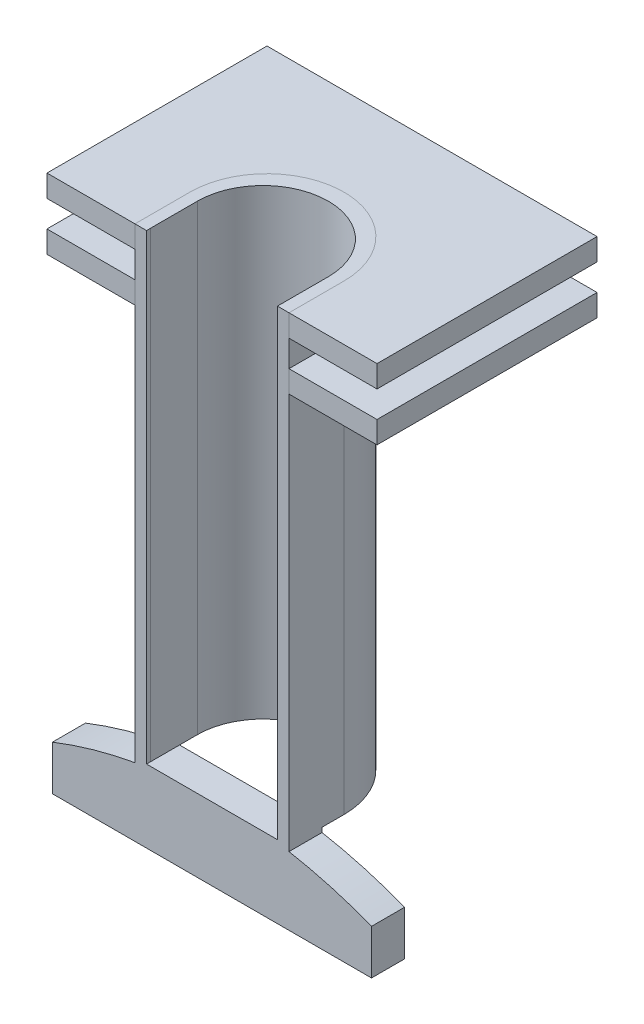
ISO-10303-21;
HEADER;
FILE_DESCRIPTION(('STEP AP214'),'2;1');
FILE_NAME('part.step','',(''),(''),'','','');
FILE_SCHEMA(('AUTOMOTIVE_DESIGN { 1 0 10303 214 1 1 1 1 }'));
ENDSEC;
DATA;
#1=APPLICATION_CONTEXT('core data for automotive mechanical design processes');
#2=APPLICATION_PROTOCOL_DEFINITION('international standard','automotive_design',2000,#1);
#3=PRODUCT_CONTEXT('',#1,'mechanical');
#4=PRODUCT('Part','Part','',(#3));
#5=PRODUCT_RELATED_PRODUCT_CATEGORY('part','',(#4));
#6=PRODUCT_DEFINITION_FORMATION('','',#4);
#7=PRODUCT_DEFINITION_CONTEXT('part definition',#1,'design');
#8=PRODUCT_DEFINITION('design','',#6,#7);
#9=PRODUCT_DEFINITION_SHAPE('','',#8);
#10=(LENGTH_UNIT() NAMED_UNIT(*) SI_UNIT(.MILLI.,.METRE.));
#11=(NAMED_UNIT(*) PLANE_ANGLE_UNIT() SI_UNIT($,.RADIAN.));
#12=(NAMED_UNIT(*) SI_UNIT($,.STERADIAN.) SOLID_ANGLE_UNIT());
#13=UNCERTAINTY_MEASURE_WITH_UNIT(LENGTH_MEASURE(1.E-05),#10,'distance_accuracy_value','');
#14=(GEOMETRIC_REPRESENTATION_CONTEXT(3) GLOBAL_UNCERTAINTY_ASSIGNED_CONTEXT((#13)) GLOBAL_UNIT_ASSIGNED_CONTEXT((#10,
#11,#12)) REPRESENTATION_CONTEXT('',''));
#15=CARTESIAN_POINT('',(0.,0.,0.));
#16=DIRECTION('',(0.,0.,1.));
#17=DIRECTION('',(1.,0.,0.));
#18=AXIS2_PLACEMENT_3D('',#15,#16,#17);
#19=CARTESIAN_POINT('',(-15.,35.6,0.));
#20=DIRECTION('',(-1.,0.,0.));
#21=DIRECTION('',(0.,0.,1.));
#22=AXIS2_PLACEMENT_3D('',#19,#20,#21);
#23=PLANE('',#22);
#24=DIRECTION('',(0.,0.,1.));
#25=VECTOR('',#24,1.);
#26=CARTESIAN_POINT('',(-15.,37.6,0.));
#27=LINE('',#26,#25);
#28=CARTESIAN_POINT('',(-15.,37.6,-20.));
#29=VERTEX_POINT('',#28);
#30=CARTESIAN_POINT('',(-15.,37.6,0.));
#31=VERTEX_POINT('',#30);
#32=EDGE_CURVE('E159',#29,#31,#27,.T.);
#33=ORIENTED_EDGE('',*,*,#32,.F.);
#34=DIRECTION('',(0.,1.,0.));
#35=VECTOR('',#34,1.);
#36=CARTESIAN_POINT('',(-15.,35.6,-20.));
#37=LINE('',#36,#35);
#38=CARTESIAN_POINT('',(-15.,35.6,-20.));
#39=VERTEX_POINT('',#38);
#40=EDGE_CURVE('E12',#39,#29,#37,.T.);
#41=ORIENTED_EDGE('',*,*,#40,.F.);
#42=DIRECTION('',(0.,0.,1.));
#43=VECTOR('',#42,1.);
#44=CARTESIAN_POINT('',(-15.,35.6,0.));
#45=LINE('',#44,#43);
#46=CARTESIAN_POINT('',(-15.,35.6,0.));
#47=VERTEX_POINT('',#46);
#48=EDGE_CURVE('E179',#39,#47,#45,.T.);
#49=ORIENTED_EDGE('',*,*,#48,.T.);
#50=DIRECTION('',(0.,1.,0.));
#51=VECTOR('',#50,1.);
#52=CARTESIAN_POINT('',(-15.,35.6,0.));
#53=LINE('',#52,#51);
#54=EDGE_CURVE('E65',#47,#31,#53,.T.);
#55=ORIENTED_EDGE('',*,*,#54,.T.);
#56=EDGE_LOOP('',(#33,#41,#49,#55));
#57=FACE_BOUND('',#56,.T.);
#58=ADVANCED_FACE('F62',(#57),#23,.T.);
#59=CARTESIAN_POINT('',(-15.,35.6,-20.));
#60=DIRECTION('',(0.,0.,-1.));
#61=DIRECTION('',(-1.,0.,0.));
#62=AXIS2_PLACEMENT_3D('',#59,#60,#61);
#63=PLANE('',#62);
#64=DIRECTION('',(-1.,0.,0.));
#65=VECTOR('',#64,1.);
#66=CARTESIAN_POINT('',(-15.,37.6,-20.));
#67=LINE('',#66,#65);
#68=CARTESIAN_POINT('',(15.,37.6,-20.));
#69=VERTEX_POINT('',#68);
#70=EDGE_CURVE('E177',#69,#29,#67,.T.);
#71=ORIENTED_EDGE('',*,*,#70,.F.);
#72=DIRECTION('',(0.,1.,0.));
#73=VECTOR('',#72,1.);
#74=CARTESIAN_POINT('',(15.,35.6,-20.));
#75=LINE('',#74,#73);
#76=CARTESIAN_POINT('',(15.,35.6,-20.));
#77=VERTEX_POINT('',#76);
#78=EDGE_CURVE('E71',#77,#69,#75,.T.);
#79=ORIENTED_EDGE('',*,*,#78,.F.);
#80=DIRECTION('',(-1.,0.,0.));
#81=VECTOR('',#80,1.);
#82=CARTESIAN_POINT('',(-15.,35.6,-20.));
#83=LINE('',#82,#81);
#84=EDGE_CURVE('E149',#77,#39,#83,.T.);
#85=ORIENTED_EDGE('',*,*,#84,.T.);
#86=ORIENTED_EDGE('',*,*,#40,.T.);
#87=EDGE_LOOP('',(#71,#79,#85,#86));
#88=FACE_BOUND('',#87,.T.);
#89=ADVANCED_FACE('F191',(#88),#63,.T.);
#90=CARTESIAN_POINT('',(15.,35.6,0.));
#91=DIRECTION('',(1.,0.,0.));
#92=DIRECTION('',(0.,0.,-1.));
#93=AXIS2_PLACEMENT_3D('',#90,#91,#92);
#94=PLANE('',#93);
#95=DIRECTION('',(0.,0.,-1.));
#96=VECTOR('',#95,1.);
#97=CARTESIAN_POINT('',(15.,37.6,0.));
#98=LINE('',#97,#96);
#99=CARTESIAN_POINT('',(15.,37.6,0.));
#100=VERTEX_POINT('',#99);
#101=EDGE_CURVE('E136',#100,#69,#98,.T.);
#102=ORIENTED_EDGE('',*,*,#101,.F.);
#103=DIRECTION('',(0.,1.,0.));
#104=VECTOR('',#103,1.);
#105=CARTESIAN_POINT('',(15.,35.6,0.));
#106=LINE('',#105,#104);
#107=CARTESIAN_POINT('',(15.,35.6,0.));
#108=VERTEX_POINT('',#107);
#109=EDGE_CURVE('E131',#108,#100,#106,.T.);
#110=ORIENTED_EDGE('',*,*,#109,.F.);
#111=DIRECTION('',(0.,0.,-1.));
#112=VECTOR('',#111,1.);
#113=CARTESIAN_POINT('',(15.,35.6,0.));
#114=LINE('',#113,#112);
#115=EDGE_CURVE('E134',#108,#77,#114,.T.);
#116=ORIENTED_EDGE('',*,*,#115,.T.);
#117=ORIENTED_EDGE('',*,*,#78,.T.);
#118=EDGE_LOOP('',(#102,#110,#116,#117));
#119=FACE_BOUND('',#118,.T.);
#120=ADVANCED_FACE('F133',(#119),#94,.T.);
#121=CARTESIAN_POINT('',(7.,35.6,0.));
#122=DIRECTION('',(0.,0.,1.));
#123=DIRECTION('',(1.,0.,0.));
#124=AXIS2_PLACEMENT_3D('',#121,#122,#123);
#125=PLANE('',#124);
#126=DIRECTION('',(1.,0.,0.));
#127=VECTOR('',#126,1.);
#128=CARTESIAN_POINT('',(7.,37.6,0.));
#129=LINE('',#128,#127);
#130=CARTESIAN_POINT('',(7.,37.6,0.));
#131=VERTEX_POINT('',#130);
#132=EDGE_CURVE('E174',#131,#100,#129,.T.);
#133=ORIENTED_EDGE('',*,*,#132,.F.);
#134=DIRECTION('',(0.,1.,0.));
#135=VECTOR('',#134,1.);
#136=CARTESIAN_POINT('',(7.,35.6,0.));
#137=LINE('',#136,#135);
#138=CARTESIAN_POINT('',(7.,35.6,0.));
#139=VERTEX_POINT('',#138);
#140=EDGE_CURVE('E141',#139,#131,#137,.T.);
#141=ORIENTED_EDGE('',*,*,#140,.F.);
#142=DIRECTION('',(1.,0.,0.));
#143=VECTOR('',#142,1.);
#144=CARTESIAN_POINT('',(7.,35.6,0.));
#145=LINE('',#144,#143);
#146=EDGE_CURVE('E147',#139,#108,#145,.T.);
#147=ORIENTED_EDGE('',*,*,#146,.T.);
#148=ORIENTED_EDGE('',*,*,#109,.T.);
#149=EDGE_LOOP('',(#133,#141,#147,#148));
#150=FACE_BOUND('',#149,.T.);
#151=ADVANCED_FACE('F151',(#150),#125,.T.);
#152=CARTESIAN_POINT('',(7.,35.6,0.));
#153=DIRECTION('',(-1.,0.,0.));
#154=DIRECTION('',(0.,0.,1.));
#155=AXIS2_PLACEMENT_3D('',#152,#153,#154);
#156=PLANE('',#155);
#157=DIRECTION('',(0.,0.,1.));
#158=VECTOR('',#157,1.);
#159=CARTESIAN_POINT('',(7.,37.6,0.));
#160=LINE('',#159,#158);
#161=CARTESIAN_POINT('',(7.,37.6,-5.));
#162=VERTEX_POINT('',#161);
#163=EDGE_CURVE('E171',#162,#131,#160,.T.);
#164=ORIENTED_EDGE('',*,*,#163,.F.);
#165=DIRECTION('',(0.,1.,0.));
#166=VECTOR('',#165,1.);
#167=CARTESIAN_POINT('',(7.,35.6,-5.));
#168=LINE('',#167,#166);
#169=CARTESIAN_POINT('',(7.,35.6,-5.));
#170=VERTEX_POINT('',#169);
#171=EDGE_CURVE('E183',#170,#162,#168,.T.);
#172=ORIENTED_EDGE('',*,*,#171,.F.);
#173=DIRECTION('',(0.,0.,1.));
#174=VECTOR('',#173,1.);
#175=CARTESIAN_POINT('',(7.,35.6,0.));
#176=LINE('',#175,#174);
#177=EDGE_CURVE('E152',#170,#139,#176,.T.);
#178=ORIENTED_EDGE('',*,*,#177,.T.);
#179=ORIENTED_EDGE('',*,*,#140,.T.);
#180=EDGE_LOOP('',(#164,#172,#178,#179));
#181=FACE_BOUND('',#180,.T.);
#182=ADVANCED_FACE('F204',(#181),#156,.T.);
#183=CARTESIAN_POINT('',(0.,35.6,-5.));
#184=DIRECTION('',(0.,1.,0.));
#185=DIRECTION('',(0.,0.,1.));
#186=AXIS2_PLACEMENT_3D('',#183,#184,#185);
#187=CYLINDRICAL_SURFACE('',#186,7.);
#188=CARTESIAN_POINT('',(0.,37.6,-5.));
#189=DIRECTION('',(0.,-1.,0.));
#190=DIRECTION('',(0.,0.,1.));
#191=AXIS2_PLACEMENT_3D('',#188,#189,#190);
#192=CIRCLE('',#191,7.);
#193=CARTESIAN_POINT('',(-7.,37.6,-5.));
#194=VERTEX_POINT('',#193);
#195=EDGE_CURVE('E168',#194,#162,#192,.T.);
#196=ORIENTED_EDGE('',*,*,#195,.F.);
#197=DIRECTION('',(0.,1.,0.));
#198=VECTOR('',#197,1.);
#199=CARTESIAN_POINT('',(-7.,35.6,-5.));
#200=LINE('',#199,#198);
#201=CARTESIAN_POINT('',(-7.,35.6,-5.));
#202=VERTEX_POINT('',#201);
#203=EDGE_CURVE('E185',#202,#194,#200,.T.);
#204=ORIENTED_EDGE('',*,*,#203,.F.);
#205=CARTESIAN_POINT('',(0.,35.6,-5.));
#206=DIRECTION('',(0.,-1.,0.));
#207=DIRECTION('',(0.,0.,1.));
#208=AXIS2_PLACEMENT_3D('',#205,#206,#207);
#209=CIRCLE('',#208,7.);
#210=EDGE_CURVE('E154',#202,#170,#209,.T.);
#211=ORIENTED_EDGE('',*,*,#210,.T.);
#212=ORIENTED_EDGE('',*,*,#171,.T.);
#213=EDGE_LOOP('',(#196,#204,#211,#212));
#214=FACE_BOUND('',#213,.T.);
#215=ADVANCED_FACE('F207',(#214),#187,.F.);
#216=CARTESIAN_POINT('',(-7.,35.6,-5.));
#217=DIRECTION('',(1.,0.,0.));
#218=DIRECTION('',(0.,0.,-1.));
#219=AXIS2_PLACEMENT_3D('',#216,#217,#218);
#220=PLANE('',#219);
#221=DIRECTION('',(0.,0.,-1.));
#222=VECTOR('',#221,1.);
#223=CARTESIAN_POINT('',(-7.,37.6,-5.));
#224=LINE('',#223,#222);
#225=CARTESIAN_POINT('',(-7.,37.6,0.));
#226=VERTEX_POINT('',#225);
#227=EDGE_CURVE('E165',#226,#194,#224,.T.);
#228=ORIENTED_EDGE('',*,*,#227,.F.);
#229=DIRECTION('',(0.,1.,0.));
#230=VECTOR('',#229,1.);
#231=CARTESIAN_POINT('',(-7.,35.6,0.));
#232=LINE('',#231,#230);
#233=CARTESIAN_POINT('',(-7.,35.6,0.));
#234=VERTEX_POINT('',#233);
#235=EDGE_CURVE('E186',#234,#226,#232,.T.);
#236=ORIENTED_EDGE('',*,*,#235,.F.);
#237=DIRECTION('',(0.,0.,-1.));
#238=VECTOR('',#237,1.);
#239=CARTESIAN_POINT('',(-7.,35.6,-5.));
#240=LINE('',#239,#238);
#241=EDGE_CURVE('E282',#234,#202,#240,.T.);
#242=ORIENTED_EDGE('',*,*,#241,.T.);
#243=ORIENTED_EDGE('',*,*,#203,.T.);
#244=EDGE_LOOP('',(#228,#236,#242,#243));
#245=FACE_BOUND('',#244,.T.);
#246=ADVANCED_FACE('F211',(#245),#220,.T.);
#247=CARTESIAN_POINT('',(-15.,35.6,0.));
#248=DIRECTION('',(0.,0.,1.));
#249=DIRECTION('',(1.,0.,0.));
#250=AXIS2_PLACEMENT_3D('',#247,#248,#249);
#251=PLANE('',#250);
#252=DIRECTION('',(1.,0.,0.));
#253=VECTOR('',#252,1.);
#254=CARTESIAN_POINT('',(-15.,37.6,0.));
#255=LINE('',#254,#253);
#256=EDGE_CURVE('E162',#31,#226,#255,.T.);
#257=ORIENTED_EDGE('',*,*,#256,.F.);
#258=ORIENTED_EDGE('',*,*,#54,.F.);
#259=DIRECTION('',(1.,0.,0.));
#260=VECTOR('',#259,1.);
#261=CARTESIAN_POINT('',(-15.,35.6,0.));
#262=LINE('',#261,#260);
#263=EDGE_CURVE('E283',#47,#234,#262,.T.);
#264=ORIENTED_EDGE('',*,*,#263,.T.);
#265=ORIENTED_EDGE('',*,*,#235,.T.);
#266=EDGE_LOOP('',(#257,#258,#264,#265));
#267=FACE_BOUND('',#266,.T.);
#268=ADVANCED_FACE('F188',(#267),#251,.T.);
#269=CARTESIAN_POINT('',(0.,35.6,-5.));
#270=DIRECTION('',(0.,1.,0.));
#271=DIRECTION('',(0.,0.,1.));
#272=AXIS2_PLACEMENT_3D('',#269,#270,#271);
#273=PLANE('',#272);
#274=ORIENTED_EDGE('',*,*,#48,.F.);
#275=ORIENTED_EDGE('',*,*,#84,.F.);
#276=ORIENTED_EDGE('',*,*,#115,.F.);
#277=ORIENTED_EDGE('',*,*,#146,.F.);
#278=ORIENTED_EDGE('',*,*,#177,.F.);
#279=ORIENTED_EDGE('',*,*,#210,.F.);
#280=ORIENTED_EDGE('',*,*,#241,.F.);
#281=ORIENTED_EDGE('',*,*,#263,.F.);
#282=EDGE_LOOP('',(#274,#275,#276,#277,#278,#279,#280,#281));
#283=FACE_BOUND('',#282,.T.);
#284=ADVANCED_FACE('F145',(#283),#273,.F.);
#285=CARTESIAN_POINT('',(0.,37.6,-5.));
#286=DIRECTION('',(0.,1.,0.));
#287=DIRECTION('',(0.,0.,1.));
#288=AXIS2_PLACEMENT_3D('',#285,#286,#287);
#289=PLANE('',#288);
#290=ORIENTED_EDGE('',*,*,#32,.T.);
#291=ORIENTED_EDGE('',*,*,#256,.T.);
#292=ORIENTED_EDGE('',*,*,#227,.T.);
#293=ORIENTED_EDGE('',*,*,#195,.T.);
#294=ORIENTED_EDGE('',*,*,#163,.T.);
#295=ORIENTED_EDGE('',*,*,#132,.T.);
#296=ORIENTED_EDGE('',*,*,#101,.T.);
#297=ORIENTED_EDGE('',*,*,#70,.T.);
#298=EDGE_LOOP('',(#290,#291,#292,#293,#294,#295,#296,#297));
#299=FACE_BOUND('',#298,.T.);
#300=ADVANCED_FACE('F190',(#299),#289,.T.);
#301=CLOSED_SHELL('',(#58,#89,#120,#151,#182,#215,#246,#268,#284,#300));
#302=MANIFOLD_SOLID_BREP('B2',#301);
#303=CARTESIAN_POINT('',(-15.,40.,0.));
#304=DIRECTION('',(-1.,0.,0.));
#305=DIRECTION('',(0.,0.,1.));
#306=AXIS2_PLACEMENT_3D('',#303,#304,#305);
#307=PLANE('',#306);
#308=DIRECTION('',(0.,0.,1.));
#309=VECTOR('',#308,1.);
#310=CARTESIAN_POINT('',(-15.,42.,0.));
#311=LINE('',#310,#309);
#312=CARTESIAN_POINT('',(-15.,42.,-20.));
#313=VERTEX_POINT('',#312);
#314=CARTESIAN_POINT('',(-15.,42.,0.));
#315=VERTEX_POINT('',#314);
#316=EDGE_CURVE('E395',#313,#315,#311,.T.);
#317=ORIENTED_EDGE('',*,*,#316,.F.);
#318=DIRECTION('',(0.,1.,0.));
#319=VECTOR('',#318,1.);
#320=CARTESIAN_POINT('',(-15.,40.,-20.));
#321=LINE('',#320,#319);
#322=CARTESIAN_POINT('',(-15.,40.,-20.));
#323=VERTEX_POINT('',#322);
#324=EDGE_CURVE('E60',#323,#313,#321,.T.);
#325=ORIENTED_EDGE('',*,*,#324,.F.);
#326=DIRECTION('',(0.,0.,1.));
#327=VECTOR('',#326,1.);
#328=CARTESIAN_POINT('',(-15.,40.,0.));
#329=LINE('',#328,#327);
#330=CARTESIAN_POINT('',(-15.,40.,0.));
#331=VERTEX_POINT('',#330);
#332=EDGE_CURVE('E415',#323,#331,#329,.T.);
#333=ORIENTED_EDGE('',*,*,#332,.T.);
#334=DIRECTION('',(0.,1.,0.));
#335=VECTOR('',#334,1.);
#336=CARTESIAN_POINT('',(-15.,40.,0.));
#337=LINE('',#336,#335);
#338=EDGE_CURVE('E301',#331,#315,#337,.T.);
#339=ORIENTED_EDGE('',*,*,#338,.T.);
#340=EDGE_LOOP('',(#317,#325,#333,#339));
#341=FACE_BOUND('',#340,.T.);
#342=ADVANCED_FACE('F298',(#341),#307,.T.);
#343=CARTESIAN_POINT('',(-15.,40.,-20.));
#344=DIRECTION('',(0.,0.,-1.));
#345=DIRECTION('',(-1.,0.,0.));
#346=AXIS2_PLACEMENT_3D('',#343,#344,#345);
#347=PLANE('',#346);
#348=DIRECTION('',(-1.,0.,0.));
#349=VECTOR('',#348,1.);
#350=CARTESIAN_POINT('',(-15.,42.,-20.));
#351=LINE('',#350,#349);
#352=CARTESIAN_POINT('',(15.,42.,-20.));
#353=VERTEX_POINT('',#352);
#354=EDGE_CURVE('E413',#353,#313,#351,.T.);
#355=ORIENTED_EDGE('',*,*,#354,.F.);
#356=DIRECTION('',(0.,1.,0.));
#357=VECTOR('',#356,1.);
#358=CARTESIAN_POINT('',(15.,40.,-20.));
#359=LINE('',#358,#357);
#360=CARTESIAN_POINT('',(15.,40.,-20.));
#361=VERTEX_POINT('',#360);
#362=EDGE_CURVE('E307',#361,#353,#359,.T.);
#363=ORIENTED_EDGE('',*,*,#362,.F.);
#364=DIRECTION('',(-1.,0.,0.));
#365=VECTOR('',#364,1.);
#366=CARTESIAN_POINT('',(-15.,40.,-20.));
#367=LINE('',#366,#365);
#368=EDGE_CURVE('E385',#361,#323,#367,.T.);
#369=ORIENTED_EDGE('',*,*,#368,.T.);
#370=ORIENTED_EDGE('',*,*,#324,.T.);
#371=EDGE_LOOP('',(#355,#363,#369,#370));
#372=FACE_BOUND('',#371,.T.);
#373=ADVANCED_FACE('F427',(#372),#347,.T.);
#374=CARTESIAN_POINT('',(15.,40.,0.));
#375=DIRECTION('',(1.,0.,0.));
#376=DIRECTION('',(0.,0.,-1.));
#377=AXIS2_PLACEMENT_3D('',#374,#375,#376);
#378=PLANE('',#377);
#379=DIRECTION('',(0.,0.,-1.));
#380=VECTOR('',#379,1.);
#381=CARTESIAN_POINT('',(15.,42.,0.));
#382=LINE('',#381,#380);
#383=CARTESIAN_POINT('',(15.,42.,0.));
#384=VERTEX_POINT('',#383);
#385=EDGE_CURVE('E372',#384,#353,#382,.T.);
#386=ORIENTED_EDGE('',*,*,#385,.F.);
#387=DIRECTION('',(0.,1.,0.));
#388=VECTOR('',#387,1.);
#389=CARTESIAN_POINT('',(15.,40.,0.));
#390=LINE('',#389,#388);
#391=CARTESIAN_POINT('',(15.,40.,0.));
#392=VERTEX_POINT('',#391);
#393=EDGE_CURVE('E367',#392,#384,#390,.T.);
#394=ORIENTED_EDGE('',*,*,#393,.F.);
#395=DIRECTION('',(0.,0.,-1.));
#396=VECTOR('',#395,1.);
#397=CARTESIAN_POINT('',(15.,40.,0.));
#398=LINE('',#397,#396);
#399=EDGE_CURVE('E370',#392,#361,#398,.T.);
#400=ORIENTED_EDGE('',*,*,#399,.T.);
#401=ORIENTED_EDGE('',*,*,#362,.T.);
#402=EDGE_LOOP('',(#386,#394,#400,#401));
#403=FACE_BOUND('',#402,.T.);
#404=ADVANCED_FACE('F369',(#403),#378,.T.);
#405=CARTESIAN_POINT('',(7.,40.,0.));
#406=DIRECTION('',(0.,0.,1.));
#407=DIRECTION('',(1.,0.,0.));
#408=AXIS2_PLACEMENT_3D('',#405,#406,#407);
#409=PLANE('',#408);
#410=DIRECTION('',(1.,0.,0.));
#411=VECTOR('',#410,1.);
#412=CARTESIAN_POINT('',(7.,42.,0.));
#413=LINE('',#412,#411);
#414=CARTESIAN_POINT('',(7.,42.,0.));
#415=VERTEX_POINT('',#414);
#416=EDGE_CURVE('E410',#415,#384,#413,.T.);
#417=ORIENTED_EDGE('',*,*,#416,.F.);
#418=DIRECTION('',(0.,1.,0.));
#419=VECTOR('',#418,1.);
#420=CARTESIAN_POINT('',(7.,40.,0.));
#421=LINE('',#420,#419);
#422=CARTESIAN_POINT('',(7.,40.,0.));
#423=VERTEX_POINT('',#422);
#424=EDGE_CURVE('E377',#423,#415,#421,.T.);
#425=ORIENTED_EDGE('',*,*,#424,.F.);
#426=DIRECTION('',(1.,0.,0.));
#427=VECTOR('',#426,1.);
#428=CARTESIAN_POINT('',(7.,40.,0.));
#429=LINE('',#428,#427);
#430=EDGE_CURVE('E383',#423,#392,#429,.T.);
#431=ORIENTED_EDGE('',*,*,#430,.T.);
#432=ORIENTED_EDGE('',*,*,#393,.T.);
#433=EDGE_LOOP('',(#417,#425,#431,#432));
#434=FACE_BOUND('',#433,.T.);
#435=ADVANCED_FACE('F387',(#434),#409,.T.);
#436=CARTESIAN_POINT('',(7.,40.,0.));
#437=DIRECTION('',(-1.,0.,0.));
#438=DIRECTION('',(0.,0.,1.));
#439=AXIS2_PLACEMENT_3D('',#436,#437,#438);
#440=PLANE('',#439);
#441=DIRECTION('',(0.,0.,1.));
#442=VECTOR('',#441,1.);
#443=CARTESIAN_POINT('',(7.,42.,0.));
#444=LINE('',#443,#442);
#445=CARTESIAN_POINT('',(7.,42.,-5.));
#446=VERTEX_POINT('',#445);
#447=EDGE_CURVE('E407',#446,#415,#444,.T.);
#448=ORIENTED_EDGE('',*,*,#447,.F.);
#449=DIRECTION('',(0.,1.,0.));
#450=VECTOR('',#449,1.);
#451=CARTESIAN_POINT('',(7.,40.,-5.));
#452=LINE('',#451,#450);
#453=CARTESIAN_POINT('',(7.,40.,-5.));
#454=VERTEX_POINT('',#453);
#455=EDGE_CURVE('E419',#454,#446,#452,.T.);
#456=ORIENTED_EDGE('',*,*,#455,.F.);
#457=DIRECTION('',(0.,0.,1.));
#458=VECTOR('',#457,1.);
#459=CARTESIAN_POINT('',(7.,40.,0.));
#460=LINE('',#459,#458);
#461=EDGE_CURVE('E388',#454,#423,#460,.T.);
#462=ORIENTED_EDGE('',*,*,#461,.T.);
#463=ORIENTED_EDGE('',*,*,#424,.T.);
#464=EDGE_LOOP('',(#448,#456,#462,#463));
#465=FACE_BOUND('',#464,.T.);
#466=ADVANCED_FACE('F440',(#465),#440,.T.);
#467=CARTESIAN_POINT('',(0.,40.,-5.));
#468=DIRECTION('',(0.,1.,0.));
#469=DIRECTION('',(0.,0.,1.));
#470=AXIS2_PLACEMENT_3D('',#467,#468,#469);
#471=CYLINDRICAL_SURFACE('',#470,7.);
#472=CARTESIAN_POINT('',(0.,42.,-5.));
#473=DIRECTION('',(0.,-1.,0.));
#474=DIRECTION('',(0.,0.,1.));
#475=AXIS2_PLACEMENT_3D('',#472,#473,#474);
#476=CIRCLE('',#475,7.);
#477=CARTESIAN_POINT('',(-7.,42.,-5.));
#478=VERTEX_POINT('',#477);
#479=EDGE_CURVE('E404',#478,#446,#476,.T.);
#480=ORIENTED_EDGE('',*,*,#479,.F.);
#481=DIRECTION('',(0.,1.,0.));
#482=VECTOR('',#481,1.);
#483=CARTESIAN_POINT('',(-7.,40.,-5.));
#484=LINE('',#483,#482);
#485=CARTESIAN_POINT('',(-7.,40.,-5.));
#486=VERTEX_POINT('',#485);
#487=EDGE_CURVE('E421',#486,#478,#484,.T.);
#488=ORIENTED_EDGE('',*,*,#487,.F.);
#489=CARTESIAN_POINT('',(0.,40.,-5.));
#490=DIRECTION('',(0.,-1.,0.));
#491=DIRECTION('',(0.,0.,1.));
#492=AXIS2_PLACEMENT_3D('',#489,#490,#491);
#493=CIRCLE('',#492,7.);
#494=EDGE_CURVE('E390',#486,#454,#493,.T.);
#495=ORIENTED_EDGE('',*,*,#494,.T.);
#496=ORIENTED_EDGE('',*,*,#455,.T.);
#497=EDGE_LOOP('',(#480,#488,#495,#496));
#498=FACE_BOUND('',#497,.T.);
#499=ADVANCED_FACE('F443',(#498),#471,.F.);
#500=CARTESIAN_POINT('',(-7.,40.,-5.));
#501=DIRECTION('',(1.,0.,0.));
#502=DIRECTION('',(0.,0.,-1.));
#503=AXIS2_PLACEMENT_3D('',#500,#501,#502);
#504=PLANE('',#503);
#505=DIRECTION('',(0.,0.,-1.));
#506=VECTOR('',#505,1.);
#507=CARTESIAN_POINT('',(-7.,42.,-5.));
#508=LINE('',#507,#506);
#509=CARTESIAN_POINT('',(-7.,42.,0.));
#510=VERTEX_POINT('',#509);
#511=EDGE_CURVE('E401',#510,#478,#508,.T.);
#512=ORIENTED_EDGE('',*,*,#511,.F.);
#513=DIRECTION('',(0.,1.,0.));
#514=VECTOR('',#513,1.);
#515=CARTESIAN_POINT('',(-7.,40.,0.));
#516=LINE('',#515,#514);
#517=CARTESIAN_POINT('',(-7.,40.,0.));
#518=VERTEX_POINT('',#517);
#519=EDGE_CURVE('E422',#518,#510,#516,.T.);
#520=ORIENTED_EDGE('',*,*,#519,.F.);
#521=DIRECTION('',(0.,0.,-1.));
#522=VECTOR('',#521,1.);
#523=CARTESIAN_POINT('',(-7.,40.,-5.));
#524=LINE('',#523,#522);
#525=EDGE_CURVE('E518',#518,#486,#524,.T.);
#526=ORIENTED_EDGE('',*,*,#525,.T.);
#527=ORIENTED_EDGE('',*,*,#487,.T.);
#528=EDGE_LOOP('',(#512,#520,#526,#527));
#529=FACE_BOUND('',#528,.T.);
#530=ADVANCED_FACE('F447',(#529),#504,.T.);
#531=CARTESIAN_POINT('',(-15.,40.,0.));
#532=DIRECTION('',(0.,0.,1.));
#533=DIRECTION('',(1.,0.,0.));
#534=AXIS2_PLACEMENT_3D('',#531,#532,#533);
#535=PLANE('',#534);
#536=DIRECTION('',(1.,0.,0.));
#537=VECTOR('',#536,1.);
#538=CARTESIAN_POINT('',(-15.,42.,0.));
#539=LINE('',#538,#537);
#540=EDGE_CURVE('E398',#315,#510,#539,.T.);
#541=ORIENTED_EDGE('',*,*,#540,.F.);
#542=ORIENTED_EDGE('',*,*,#338,.F.);
#543=DIRECTION('',(1.,0.,0.));
#544=VECTOR('',#543,1.);
#545=CARTESIAN_POINT('',(-15.,40.,0.));
#546=LINE('',#545,#544);
#547=EDGE_CURVE('E519',#331,#518,#546,.T.);
#548=ORIENTED_EDGE('',*,*,#547,.T.);
#549=ORIENTED_EDGE('',*,*,#519,.T.);
#550=EDGE_LOOP('',(#541,#542,#548,#549));
#551=FACE_BOUND('',#550,.T.);
#552=ADVANCED_FACE('F424',(#551),#535,.T.);
#553=CARTESIAN_POINT('',(0.,40.,-5.));
#554=DIRECTION('',(0.,1.,0.));
#555=DIRECTION('',(0.,0.,1.));
#556=AXIS2_PLACEMENT_3D('',#553,#554,#555);
#557=PLANE('',#556);
#558=ORIENTED_EDGE('',*,*,#332,.F.);
#559=ORIENTED_EDGE('',*,*,#368,.F.);
#560=ORIENTED_EDGE('',*,*,#399,.F.);
#561=ORIENTED_EDGE('',*,*,#430,.F.);
#562=ORIENTED_EDGE('',*,*,#461,.F.);
#563=ORIENTED_EDGE('',*,*,#494,.F.);
#564=ORIENTED_EDGE('',*,*,#525,.F.);
#565=ORIENTED_EDGE('',*,*,#547,.F.);
#566=EDGE_LOOP('',(#558,#559,#560,#561,#562,#563,#564,#565));
#567=FACE_BOUND('',#566,.T.);
#568=ADVANCED_FACE('F381',(#567),#557,.F.);
#569=CARTESIAN_POINT('',(0.,42.,-5.));
#570=DIRECTION('',(0.,1.,0.));
#571=DIRECTION('',(0.,0.,1.));
#572=AXIS2_PLACEMENT_3D('',#569,#570,#571);
#573=PLANE('',#572);
#574=ORIENTED_EDGE('',*,*,#316,.T.);
#575=ORIENTED_EDGE('',*,*,#540,.T.);
#576=ORIENTED_EDGE('',*,*,#511,.T.);
#577=ORIENTED_EDGE('',*,*,#479,.T.);
#578=ORIENTED_EDGE('',*,*,#447,.T.);
#579=ORIENTED_EDGE('',*,*,#416,.T.);
#580=ORIENTED_EDGE('',*,*,#385,.T.);
#581=ORIENTED_EDGE('',*,*,#354,.T.);
#582=EDGE_LOOP('',(#574,#575,#576,#577,#578,#579,#580,#581));
#583=FACE_BOUND('',#582,.T.);
#584=ADVANCED_FACE('F426',(#583),#573,.T.);
#585=CLOSED_SHELL('',(#342,#373,#404,#435,#466,#499,#530,#552,#568,#584));
#586=MANIFOLD_SOLID_BREP('B6',#585);
#587=CARTESIAN_POINT('',(0.,42.,-0.375));
#588=DIRECTION('',(0.,-1.,0.));
#589=DIRECTION('',(0.,0.,-1.));
#590=AXIS2_PLACEMENT_3D('',#587,#588,#589);
#591=CYLINDRICAL_SURFACE('',#590,5.95);
#592=CARTESIAN_POINT('',(0.,0.,-0.375));
#593=DIRECTION('',(0.,1.,0.));
#594=DIRECTION('',(0.,0.,1.));
#595=AXIS2_PLACEMENT_3D('',#592,#593,#594);
#596=CIRCLE('',#595,5.95);
#597=CARTESIAN_POINT('',(5.93817101471488,0.,0.));
#598=VERTEX_POINT('',#597);
#599=CARTESIAN_POINT('',(5.95,0.,-0.375));
#600=VERTEX_POINT('',#599);
#601=EDGE_CURVE('E714',#598,#600,#596,.T.);
#602=ORIENTED_EDGE('',*,*,#601,.F.);
#603=DIRECTION('',(0.,-1.,0.));
#604=VECTOR('',#603,1.);
#605=CARTESIAN_POINT('',(5.93817101471488,42.,0.));
#606=LINE('',#605,#604);
#607=CARTESIAN_POINT('',(5.93817101471488,42.,0.));
#608=VERTEX_POINT('',#607);
#609=EDGE_CURVE('E529',#608,#598,#606,.T.);
#610=ORIENTED_EDGE('',*,*,#609,.F.);
#611=CARTESIAN_POINT('',(0.,42.,-0.375));
#612=DIRECTION('',(0.,1.,0.));
#613=DIRECTION('',(0.,0.,1.));
#614=AXIS2_PLACEMENT_3D('',#611,#612,#613);
#615=CIRCLE('',#614,5.95);
#616=CARTESIAN_POINT('',(5.95,42.,-0.375));
#617=VERTEX_POINT('',#616);
#618=EDGE_CURVE('E727',#608,#617,#615,.T.);
#619=ORIENTED_EDGE('',*,*,#618,.T.);
#620=DIRECTION('',(0.,-1.,0.));
#621=VECTOR('',#620,1.);
#622=CARTESIAN_POINT('',(5.95,42.,-0.375));
#623=LINE('',#622,#621);
#624=EDGE_CURVE('E763',#617,#600,#623,.T.);
#625=ORIENTED_EDGE('',*,*,#624,.T.);
#626=EDGE_LOOP('',(#602,#610,#619,#625));
#627=FACE_BOUND('',#626,.T.);
#628=ADVANCED_FACE('F526',(#627),#591,.F.);
#629=CARTESIAN_POINT('',(7.,42.,0.));
#630=DIRECTION('',(-1.,0.,0.));
#631=DIRECTION('',(0.,0.,1.));
#632=AXIS2_PLACEMENT_3D('',#629,#630,#631);
#633=PLANE('',#632);
#634=DIRECTION('',(0.,-1.,0.));
#635=VECTOR('',#634,1.);
#636=CARTESIAN_POINT('',(7.,42.,0.));
#637=LINE('',#636,#635);
#638=CARTESIAN_POINT('',(7.,42.,0.));
#639=VERTEX_POINT('',#638);
#640=CARTESIAN_POINT('',(7.,-0.41578507890394,0.));
#641=VERTEX_POINT('',#640);
#642=EDGE_CURVE('E820',#639,#641,#637,.T.);
#643=ORIENTED_EDGE('',*,*,#642,.T.);
#644=DIRECTION('',(0.,0.,1.));
#645=VECTOR('',#644,1.);
#646=CARTESIAN_POINT('',(7.,-0.41578507890394,-3.));
#647=LINE('',#646,#645);
#648=CARTESIAN_POINT('',(7.,-0.41578507890394,-3.));
#649=VERTEX_POINT('',#648);
#650=EDGE_CURVE('E715',#649,#641,#647,.T.);
#651=ORIENTED_EDGE('',*,*,#650,.F.);
#652=DIRECTION('',(0.,1.,0.));
#653=VECTOR('',#652,1.);
#654=CARTESIAN_POINT('',(7.,0.,-3.));
#655=LINE('',#654,#653);
#656=CARTESIAN_POINT('',(7.,0.,-3.));
#657=VERTEX_POINT('',#656);
#658=EDGE_CURVE('E688',#649,#657,#655,.T.);
#659=ORIENTED_EDGE('',*,*,#658,.T.);
#660=DIRECTION('',(0.,0.,-1.));
#661=VECTOR('',#660,1.);
#662=CARTESIAN_POINT('',(7.,0.,0.));
#663=LINE('',#662,#661);
#664=CARTESIAN_POINT('',(7.,0.,-5.));
#665=VERTEX_POINT('',#664);
#666=EDGE_CURVE('E766',#657,#665,#663,.T.);
#667=ORIENTED_EDGE('',*,*,#666,.T.);
#668=DIRECTION('',(0.,-1.,0.));
#669=VECTOR('',#668,1.);
#670=CARTESIAN_POINT('',(7.,42.,-5.));
#671=LINE('',#670,#669);
#672=CARTESIAN_POINT('',(7.,42.,-5.));
#673=VERTEX_POINT('',#672);
#674=EDGE_CURVE('E817',#673,#665,#671,.T.);
#675=ORIENTED_EDGE('',*,*,#674,.F.);
#676=DIRECTION('',(0.,0.,-1.));
#677=VECTOR('',#676,1.);
#678=CARTESIAN_POINT('',(7.,42.,0.));
#679=LINE('',#678,#677);
#680=EDGE_CURVE('E735',#639,#673,#679,.T.);
#681=ORIENTED_EDGE('',*,*,#680,.F.);
#682=EDGE_LOOP('',(#643,#651,#659,#667,#675,#681));
#683=FACE_BOUND('',#682,.T.);
#684=ADVANCED_FACE('F862',(#683),#633,.F.);
#685=CARTESIAN_POINT('',(0.,42.,-5.));
#686=DIRECTION('',(0.,-1.,0.));
#687=DIRECTION('',(0.,0.,-1.));
#688=AXIS2_PLACEMENT_3D('',#685,#686,#687);
#689=CYLINDRICAL_SURFACE('',#688,7.);
#690=CARTESIAN_POINT('',(0.,0.,-5.));
#691=DIRECTION('',(0.,1.,0.));
#692=DIRECTION('',(0.,0.,1.));
#693=AXIS2_PLACEMENT_3D('',#690,#691,#692);
#694=CIRCLE('',#693,7.);
#695=CARTESIAN_POINT('',(-7.,0.,-5.));
#696=VERTEX_POINT('',#695);
#697=EDGE_CURVE('E769',#665,#696,#694,.T.);
#698=ORIENTED_EDGE('',*,*,#697,.T.);
#699=DIRECTION('',(0.,-1.,0.));
#700=VECTOR('',#699,1.);
#701=CARTESIAN_POINT('',(-7.,42.,-5.));
#702=LINE('',#701,#700);
#703=CARTESIAN_POINT('',(-7.,42.,-5.));
#704=VERTEX_POINT('',#703);
#705=EDGE_CURVE('E813',#704,#696,#702,.T.);
#706=ORIENTED_EDGE('',*,*,#705,.F.);
#707=CARTESIAN_POINT('',(0.,42.,-5.));
#708=DIRECTION('',(0.,1.,0.));
#709=DIRECTION('',(0.,0.,1.));
#710=AXIS2_PLACEMENT_3D('',#707,#708,#709);
#711=CIRCLE('',#710,7.);
#712=EDGE_CURVE('E738',#673,#704,#711,.T.);
#713=ORIENTED_EDGE('',*,*,#712,.F.);
#714=ORIENTED_EDGE('',*,*,#674,.T.);
#715=EDGE_LOOP('',(#698,#706,#713,#714));
#716=FACE_BOUND('',#715,.T.);
#717=ADVANCED_FACE('F895',(#716),#689,.T.);
#718=CARTESIAN_POINT('',(-7.,42.,0.));
#719=DIRECTION('',(-1.,0.,0.));
#720=DIRECTION('',(0.,0.,1.));
#721=AXIS2_PLACEMENT_3D('',#718,#719,#720);
#722=PLANE('',#721);
#723=DIRECTION('',(0.,0.,-1.));
#724=VECTOR('',#723,1.);
#725=CARTESIAN_POINT('',(-7.,0.,0.));
#726=LINE('',#725,#724);
#727=CARTESIAN_POINT('',(-7.,0.,-3.));
#728=VERTEX_POINT('',#727);
#729=EDGE_CURVE('E773',#728,#696,#726,.T.);
#730=ORIENTED_EDGE('',*,*,#729,.F.);
#731=DIRECTION('',(0.,-1.,0.));
#732=VECTOR('',#731,1.);
#733=CARTESIAN_POINT('',(-7.,0.,-3.));
#734=LINE('',#733,#732);
#735=CARTESIAN_POINT('',(-7.,-0.415785078903976,-3.));
#736=VERTEX_POINT('',#735);
#737=EDGE_CURVE('E544',#728,#736,#734,.T.);
#738=ORIENTED_EDGE('',*,*,#737,.T.);
#739=DIRECTION('',(0.,0.,1.));
#740=VECTOR('',#739,1.);
#741=CARTESIAN_POINT('',(-7.,-0.415785078903976,-3.));
#742=LINE('',#741,#740);
#743=CARTESIAN_POINT('',(-7.,-0.415785078903976,0.));
#744=VERTEX_POINT('',#743);
#745=EDGE_CURVE('E669',#736,#744,#742,.T.);
#746=ORIENTED_EDGE('',*,*,#745,.T.);
#747=DIRECTION('',(0.,-1.,0.));
#748=VECTOR('',#747,1.);
#749=CARTESIAN_POINT('',(-7.,42.,0.));
#750=LINE('',#749,#748);
#751=CARTESIAN_POINT('',(-7.,42.,0.));
#752=VERTEX_POINT('',#751);
#753=EDGE_CURVE('E810',#752,#744,#750,.T.);
#754=ORIENTED_EDGE('',*,*,#753,.F.);
#755=DIRECTION('',(0.,0.,-1.));
#756=VECTOR('',#755,1.);
#757=CARTESIAN_POINT('',(-7.,42.,0.));
#758=LINE('',#757,#756);
#759=EDGE_CURVE('E741',#752,#704,#758,.T.);
#760=ORIENTED_EDGE('',*,*,#759,.T.);
#761=ORIENTED_EDGE('',*,*,#705,.T.);
#762=EDGE_LOOP('',(#730,#738,#746,#754,#760,#761));
#763=FACE_BOUND('',#762,.T.);
#764=ADVANCED_FACE('F850',(#763),#722,.T.);
#765=CARTESIAN_POINT('',(0.,42.,0.));
#766=DIRECTION('',(0.,0.,-1.));
#767=DIRECTION('',(-1.,0.,0.));
#768=AXIS2_PLACEMENT_3D('',#765,#766,#767);
#769=PLANE('',#768);
#770=ORIENTED_EDGE('',*,*,#753,.T.);
#771=CARTESIAN_POINT('',(1.04083408558608E-13,-39.2905841137543,0.));
#772=DIRECTION('',(0.,0.,1.));
#773=DIRECTION('',(-1.,0.,0.));
#774=AXIS2_PLACEMENT_3D('',#771,#772,#773);
#775=CIRCLE('',#774,39.5);
#776=CARTESIAN_POINT('',(-14.4999999999999,-2.54823797200662,0.));
#777=VERTEX_POINT('',#776);
#778=EDGE_CURVE('E696',#744,#777,#775,.T.);
#779=ORIENTED_EDGE('',*,*,#778,.T.);
#780=DIRECTION('',(0.,-1.,0.));
#781=VECTOR('',#780,1.);
#782=CARTESIAN_POINT('',(-14.4999999999999,-2.54823797200662,0.));
#783=LINE('',#782,#781);
#784=CARTESIAN_POINT('',(-14.4999999999999,-6.61528302736195,0.));
#785=VERTEX_POINT('',#784);
#786=EDGE_CURVE('E651',#777,#785,#783,.T.);
#787=ORIENTED_EDGE('',*,*,#786,.T.);
#788=DIRECTION('',(1.,0.,0.));
#789=VECTOR('',#788,1.);
#790=CARTESIAN_POINT('',(-14.4999999999999,-6.61528302736195,0.));
#791=LINE('',#790,#789);
#792=CARTESIAN_POINT('',(14.5000000000001,-6.61528302736195,0.));
#793=VERTEX_POINT('',#792);
#794=EDGE_CURVE('E701',#785,#793,#791,.T.);
#795=ORIENTED_EDGE('',*,*,#794,.T.);
#796=DIRECTION('',(0.,1.,0.));
#797=VECTOR('',#796,1.);
#798=CARTESIAN_POINT('',(14.5000000000001,-6.61528302736195,0.));
#799=LINE('',#798,#797);
#800=CARTESIAN_POINT('',(14.5000000000001,-2.54823797200662,0.));
#801=VERTEX_POINT('',#800);
#802=EDGE_CURVE('E705',#793,#801,#799,.T.);
#803=ORIENTED_EDGE('',*,*,#802,.T.);
#804=CARTESIAN_POINT('',(1.04083408558608E-13,-39.2905841137543,0.));
#805=DIRECTION('',(0.,0.,1.));
#806=DIRECTION('',(1.,0.,0.));
#807=AXIS2_PLACEMENT_3D('',#804,#805,#806);
#808=CIRCLE('',#807,39.5);
#809=EDGE_CURVE('E675',#801,#641,#808,.T.);
#810=ORIENTED_EDGE('',*,*,#809,.T.);
#811=ORIENTED_EDGE('',*,*,#642,.F.);
#812=DIRECTION('',(1.,0.,0.));
#813=VECTOR('',#812,1.);
#814=CARTESIAN_POINT('',(0.,42.,0.));
#815=LINE('',#814,#813);
#816=EDGE_CURVE('E731',#608,#639,#815,.T.);
#817=ORIENTED_EDGE('',*,*,#816,.F.);
#818=ORIENTED_EDGE('',*,*,#609,.T.);
#819=DIRECTION('',(-1.,0.,0.));
#820=VECTOR('',#819,1.);
#821=CARTESIAN_POINT('',(-7.,0.,0.));
#822=LINE('',#821,#820);
#823=CARTESIAN_POINT('',(-5.93817101471488,0.,0.));
#824=VERTEX_POINT('',#823);
#825=EDGE_CURVE('E671',#598,#824,#822,.T.);
#826=ORIENTED_EDGE('',*,*,#825,.T.);
#827=DIRECTION('',(0.,-1.,0.));
#828=VECTOR('',#827,1.);
#829=CARTESIAN_POINT('',(-5.93817101471488,42.,0.));
#830=LINE('',#829,#828);
#831=CARTESIAN_POINT('',(-5.93817101471488,42.,0.));
#832=VERTEX_POINT('',#831);
#833=EDGE_CURVE('E806',#832,#824,#830,.T.);
#834=ORIENTED_EDGE('',*,*,#833,.F.);
#835=DIRECTION('',(1.,0.,0.));
#836=VECTOR('',#835,1.);
#837=CARTESIAN_POINT('',(0.,42.,0.));
#838=LINE('',#837,#836);
#839=EDGE_CURVE('E745',#752,#832,#838,.T.);
#840=ORIENTED_EDGE('',*,*,#839,.F.);
#841=EDGE_LOOP('',(#770,#779,#787,#795,#803,#810,#811,#817,#818,#826,#834,#840));
#842=FACE_BOUND('',#841,.T.);
#843=ADVANCED_FACE('F830',(#842),#769,.F.);
#844=CARTESIAN_POINT('',(0.,42.,-0.375));
#845=DIRECTION('',(0.,-1.,0.));
#846=DIRECTION('',(0.,0.,-1.));
#847=AXIS2_PLACEMENT_3D('',#844,#845,#846);
#848=CYLINDRICAL_SURFACE('',#847,5.95);
#849=CARTESIAN_POINT('',(0.,0.,-0.375));
#850=DIRECTION('',(0.,1.,0.));
#851=DIRECTION('',(0.,0.,1.));
#852=AXIS2_PLACEMENT_3D('',#849,#850,#851);
#853=CIRCLE('',#852,5.95);
#854=CARTESIAN_POINT('',(-5.95,0.,-0.375));
#855=VERTEX_POINT('',#854);
#856=EDGE_CURVE('E776',#855,#824,#853,.T.);
#857=ORIENTED_EDGE('',*,*,#856,.F.);
#858=DIRECTION('',(0.,-1.,0.));
#859=VECTOR('',#858,1.);
#860=CARTESIAN_POINT('',(-5.95,42.,-0.375));
#861=LINE('',#860,#859);
#862=CARTESIAN_POINT('',(-5.95,42.,-0.375));
#863=VERTEX_POINT('',#862);
#864=EDGE_CURVE('E802',#863,#855,#861,.T.);
#865=ORIENTED_EDGE('',*,*,#864,.F.);
#866=CARTESIAN_POINT('',(0.,42.,-0.375));
#867=DIRECTION('',(0.,1.,0.));
#868=DIRECTION('',(0.,0.,1.));
#869=AXIS2_PLACEMENT_3D('',#866,#867,#868);
#870=CIRCLE('',#869,5.95);
#871=EDGE_CURVE('E748',#863,#832,#870,.T.);
#872=ORIENTED_EDGE('',*,*,#871,.T.);
#873=ORIENTED_EDGE('',*,*,#833,.T.);
#874=EDGE_LOOP('',(#857,#865,#872,#873));
#875=FACE_BOUND('',#874,.T.);
#876=ADVANCED_FACE('F839',(#875),#848,.F.);
#877=CARTESIAN_POINT('',(-5.95,42.,0.));
#878=DIRECTION('',(-1.,0.,0.));
#879=DIRECTION('',(0.,0.,1.));
#880=AXIS2_PLACEMENT_3D('',#877,#878,#879);
#881=PLANE('',#880);
#882=DIRECTION('',(0.,0.,-1.));
#883=VECTOR('',#882,1.);
#884=CARTESIAN_POINT('',(-5.95,0.,0.));
#885=LINE('',#884,#883);
#886=CARTESIAN_POINT('',(-5.95,0.,-3.));
#887=VERTEX_POINT('',#886);
#888=EDGE_CURVE('E780',#855,#887,#885,.T.);
#889=ORIENTED_EDGE('',*,*,#888,.T.);
#890=CARTESIAN_POINT('',(-5.95,0.,-4.625));
#891=VERTEX_POINT('',#890);
#892=EDGE_CURVE('E779',#887,#891,#885,.T.);
#893=ORIENTED_EDGE('',*,*,#892,.T.);
#894=DIRECTION('',(0.,-1.,0.));
#895=VECTOR('',#894,1.);
#896=CARTESIAN_POINT('',(-5.95,42.,-4.625));
#897=LINE('',#896,#895);
#898=CARTESIAN_POINT('',(-5.95,42.,-4.625));
#899=VERTEX_POINT('',#898);
#900=EDGE_CURVE('E798',#899,#891,#897,.T.);
#901=ORIENTED_EDGE('',*,*,#900,.F.);
#902=DIRECTION('',(0.,0.,-1.));
#903=VECTOR('',#902,1.);
#904=CARTESIAN_POINT('',(-5.95,42.,0.));
#905=LINE('',#904,#903);
#906=EDGE_CURVE('E752',#863,#899,#905,.T.);
#907=ORIENTED_EDGE('',*,*,#906,.F.);
#908=ORIENTED_EDGE('',*,*,#864,.T.);
#909=EDGE_LOOP('',(#889,#893,#901,#907,#908));
#910=FACE_BOUND('',#909,.T.);
#911=ADVANCED_FACE('F878',(#910),#881,.F.);
#912=CARTESIAN_POINT('',(0.,42.,-4.625));
#913=DIRECTION('',(0.,-1.,0.));
#914=DIRECTION('',(0.,0.,-1.));
#915=AXIS2_PLACEMENT_3D('',#912,#913,#914);
#916=CYLINDRICAL_SURFACE('',#915,5.95);
#917=CARTESIAN_POINT('',(0.,0.,-4.625));
#918=DIRECTION('',(0.,1.,0.));
#919=DIRECTION('',(0.,0.,1.));
#920=AXIS2_PLACEMENT_3D('',#917,#918,#919);
#921=CIRCLE('',#920,5.95);
#922=CARTESIAN_POINT('',(5.95,0.,-4.625));
#923=VERTEX_POINT('',#922);
#924=EDGE_CURVE('E784',#923,#891,#921,.T.);
#925=ORIENTED_EDGE('',*,*,#924,.F.);
#926=DIRECTION('',(0.,-1.,0.));
#927=VECTOR('',#926,1.);
#928=CARTESIAN_POINT('',(5.95,42.,-4.625));
#929=LINE('',#928,#927);
#930=CARTESIAN_POINT('',(5.95,42.,-4.625));
#931=VERTEX_POINT('',#930);
#932=EDGE_CURVE('E794',#931,#923,#929,.T.);
#933=ORIENTED_EDGE('',*,*,#932,.F.);
#934=CARTESIAN_POINT('',(0.,42.,-4.625));
#935=DIRECTION('',(0.,1.,0.));
#936=DIRECTION('',(0.,0.,1.));
#937=AXIS2_PLACEMENT_3D('',#934,#935,#936);
#938=CIRCLE('',#937,5.95);
#939=EDGE_CURVE('E755',#931,#899,#938,.T.);
#940=ORIENTED_EDGE('',*,*,#939,.T.);
#941=ORIENTED_EDGE('',*,*,#900,.T.);
#942=EDGE_LOOP('',(#925,#933,#940,#941));
#943=FACE_BOUND('',#942,.T.);
#944=ADVANCED_FACE('F880',(#943),#916,.F.);
#945=CARTESIAN_POINT('',(5.95,42.,0.));
#946=DIRECTION('',(-1.,0.,0.));
#947=DIRECTION('',(0.,0.,1.));
#948=AXIS2_PLACEMENT_3D('',#945,#946,#947);
#949=PLANE('',#948);
#950=DIRECTION('',(0.,0.,-1.));
#951=VECTOR('',#950,1.);
#952=CARTESIAN_POINT('',(5.95,0.,0.));
#953=LINE('',#952,#951);
#954=CARTESIAN_POINT('',(5.95,0.,-3.));
#955=VERTEX_POINT('',#954);
#956=EDGE_CURVE('E732',#600,#955,#953,.T.);
#957=ORIENTED_EDGE('',*,*,#956,.F.);
#958=ORIENTED_EDGE('',*,*,#624,.F.);
#959=DIRECTION('',(0.,0.,-1.));
#960=VECTOR('',#959,1.);
#961=CARTESIAN_POINT('',(5.95,42.,0.));
#962=LINE('',#961,#960);
#963=EDGE_CURVE('E759',#617,#931,#962,.T.);
#964=ORIENTED_EDGE('',*,*,#963,.T.);
#965=ORIENTED_EDGE('',*,*,#932,.T.);
#966=EDGE_CURVE('E788',#955,#923,#953,.T.);
#967=ORIENTED_EDGE('',*,*,#966,.F.);
#968=EDGE_LOOP('',(#957,#958,#964,#965,#967));
#969=FACE_BOUND('',#968,.T.);
#970=ADVANCED_FACE('F866',(#969),#949,.T.);
#971=CARTESIAN_POINT('',(0.,42.,0.));
#972=DIRECTION('',(0.,1.,0.));
#973=DIRECTION('',(0.,0.,1.));
#974=AXIS2_PLACEMENT_3D('',#971,#972,#973);
#975=PLANE('',#974);
#976=ORIENTED_EDGE('',*,*,#618,.F.);
#977=ORIENTED_EDGE('',*,*,#816,.T.);
#978=ORIENTED_EDGE('',*,*,#680,.T.);
#979=ORIENTED_EDGE('',*,*,#712,.T.);
#980=ORIENTED_EDGE('',*,*,#759,.F.);
#981=ORIENTED_EDGE('',*,*,#839,.T.);
#982=ORIENTED_EDGE('',*,*,#871,.F.);
#983=ORIENTED_EDGE('',*,*,#906,.T.);
#984=ORIENTED_EDGE('',*,*,#939,.F.);
#985=ORIENTED_EDGE('',*,*,#963,.F.);
#986=EDGE_LOOP('',(#976,#977,#978,#979,#980,#981,#982,#983,#984,#985));
#987=FACE_BOUND('',#986,.T.);
#988=ADVANCED_FACE('F845',(#987),#975,.T.);
#989=CARTESIAN_POINT('',(0.,0.,0.));
#990=DIRECTION('',(0.,1.,0.));
#991=DIRECTION('',(0.,0.,1.));
#992=AXIS2_PLACEMENT_3D('',#989,#990,#991);
#993=PLANE('',#992);
#994=ORIENTED_EDGE('',*,*,#666,.F.);
#995=DIRECTION('',(-1.,0.,0.));
#996=VECTOR('',#995,1.);
#997=CARTESIAN_POINT('',(-7.,0.,-3.));
#998=LINE('',#997,#996);
#999=EDGE_CURVE('E536',#657,#955,#998,.T.);
#1000=ORIENTED_EDGE('',*,*,#999,.T.);
#1001=ORIENTED_EDGE('',*,*,#966,.T.);
#1002=ORIENTED_EDGE('',*,*,#924,.T.);
#1003=ORIENTED_EDGE('',*,*,#892,.F.);
#1004=EDGE_CURVE('E296',#887,#728,#998,.T.);
#1005=ORIENTED_EDGE('',*,*,#1004,.T.);
#1006=ORIENTED_EDGE('',*,*,#729,.T.);
#1007=ORIENTED_EDGE('',*,*,#697,.F.);
#1008=EDGE_LOOP('',(#994,#1000,#1001,#1002,#1003,#1005,#1006,#1007));
#1009=FACE_BOUND('',#1008,.T.);
#1010=ADVANCED_FACE('F875',(#1009),#993,.F.);
#1011=CARTESIAN_POINT('',(-7.,0.,-3.));
#1012=DIRECTION('',(0.,1.,0.));
#1013=DIRECTION('',(0.,0.,1.));
#1014=AXIS2_PLACEMENT_3D('',#1011,#1012,#1013);
#1015=PLANE('',#1014);
#1016=ORIENTED_EDGE('',*,*,#825,.F.);
#1017=ORIENTED_EDGE('',*,*,#601,.T.);
#1018=ORIENTED_EDGE('',*,*,#956,.T.);
#1019=EDGE_CURVE('E537',#955,#887,#998,.T.);
#1020=ORIENTED_EDGE('',*,*,#1019,.T.);
#1021=ORIENTED_EDGE('',*,*,#888,.F.);
#1022=ORIENTED_EDGE('',*,*,#856,.T.);
#1023=EDGE_LOOP('',(#1016,#1017,#1018,#1020,#1021,#1022));
#1024=FACE_BOUND('',#1023,.T.);
#1025=ADVANCED_FACE('F836',(#1024),#1015,.T.);
#1026=CARTESIAN_POINT('',(1.04083408558608E-13,-39.2905841137543,-3.));
#1027=DIRECTION('',(0.,0.,1.));
#1028=DIRECTION('',(1.,0.,0.));
#1029=AXIS2_PLACEMENT_3D('',#1026,#1027,#1028);
#1030=CYLINDRICAL_SURFACE('',#1029,39.5);
#1031=ORIENTED_EDGE('',*,*,#778,.F.);
#1032=ORIENTED_EDGE('',*,*,#745,.F.);
#1033=CARTESIAN_POINT('',(1.04083408558608E-13,-39.2905841137543,-3.));
#1034=DIRECTION('',(0.,0.,1.));
#1035=DIRECTION('',(-1.,0.,0.));
#1036=AXIS2_PLACEMENT_3D('',#1033,#1034,#1035);
#1037=CIRCLE('',#1036,39.5);
#1038=CARTESIAN_POINT('',(-14.4999999999999,-2.54823797200662,-3.));
#1039=VERTEX_POINT('',#1038);
#1040=EDGE_CURVE('E661',#736,#1039,#1037,.T.);
#1041=ORIENTED_EDGE('',*,*,#1040,.T.);
#1042=DIRECTION('',(0.,0.,1.));
#1043=VECTOR('',#1042,1.);
#1044=CARTESIAN_POINT('',(-14.4999999999999,-2.54823797200662,-3.));
#1045=LINE('',#1044,#1043);
#1046=EDGE_CURVE('E646',#1039,#777,#1045,.T.);
#1047=ORIENTED_EDGE('',*,*,#1046,.T.);
#1048=EDGE_LOOP('',(#1031,#1032,#1041,#1047));
#1049=FACE_BOUND('',#1048,.T.);
#1050=ADVANCED_FACE('F667',(#1049),#1030,.T.);
#1051=CARTESIAN_POINT('',(1.04083408558608E-13,-39.2905841137543,-3.));
#1052=DIRECTION('',(0.,0.,1.));
#1053=DIRECTION('',(1.,0.,0.));
#1054=AXIS2_PLACEMENT_3D('',#1051,#1052,#1053);
#1055=CYLINDRICAL_SURFACE('',#1054,39.5);
#1056=ORIENTED_EDGE('',*,*,#809,.F.);
#1057=DIRECTION('',(0.,0.,1.));
#1058=VECTOR('',#1057,1.);
#1059=CARTESIAN_POINT('',(14.5000000000001,-2.54823797200662,-3.));
#1060=LINE('',#1059,#1058);
#1061=CARTESIAN_POINT('',(14.5000000000001,-2.54823797200662,-3.));
#1062=VERTEX_POINT('',#1061);
#1063=EDGE_CURVE('E719',#1062,#801,#1060,.T.);
#1064=ORIENTED_EDGE('',*,*,#1063,.F.);
#1065=CARTESIAN_POINT('',(1.04083408558608E-13,-39.2905841137543,-3.));
#1066=DIRECTION('',(0.,0.,1.));
#1067=DIRECTION('',(1.,0.,0.));
#1068=AXIS2_PLACEMENT_3D('',#1065,#1066,#1067);
#1069=CIRCLE('',#1068,39.5);
#1070=EDGE_CURVE('E684',#1062,#649,#1069,.T.);
#1071=ORIENTED_EDGE('',*,*,#1070,.T.);
#1072=ORIENTED_EDGE('',*,*,#650,.T.);
#1073=EDGE_LOOP('',(#1056,#1064,#1071,#1072));
#1074=FACE_BOUND('',#1073,.T.);
#1075=ADVANCED_FACE('F860',(#1074),#1055,.T.);
#1076=CARTESIAN_POINT('',(14.5000000000001,-6.61528302736195,-3.));
#1077=DIRECTION('',(1.,0.,0.));
#1078=DIRECTION('',(0.,0.,-1.));
#1079=AXIS2_PLACEMENT_3D('',#1076,#1077,#1078);
#1080=PLANE('',#1079);
#1081=ORIENTED_EDGE('',*,*,#802,.F.);
#1082=DIRECTION('',(0.,0.,1.));
#1083=VECTOR('',#1082,1.);
#1084=CARTESIAN_POINT('',(14.5000000000001,-6.61528302736195,-3.));
#1085=LINE('',#1084,#1083);
#1086=CARTESIAN_POINT('',(14.5000000000001,-6.61528302736195,-3.));
#1087=VERTEX_POINT('',#1086);
#1088=EDGE_CURVE('E722',#1087,#793,#1085,.T.);
#1089=ORIENTED_EDGE('',*,*,#1088,.F.);
#1090=DIRECTION('',(0.,1.,0.));
#1091=VECTOR('',#1090,1.);
#1092=CARTESIAN_POINT('',(14.5000000000001,-6.61528302736195,-3.));
#1093=LINE('',#1092,#1091);
#1094=EDGE_CURVE('E680',#1087,#1062,#1093,.T.);
#1095=ORIENTED_EDGE('',*,*,#1094,.T.);
#1096=ORIENTED_EDGE('',*,*,#1063,.T.);
#1097=EDGE_LOOP('',(#1081,#1089,#1095,#1096));
#1098=FACE_BOUND('',#1097,.T.);
#1099=ADVANCED_FACE('F856',(#1098),#1080,.T.);
#1100=CARTESIAN_POINT('',(-14.4999999999999,-6.61528302736195,-3.));
#1101=DIRECTION('',(0.,-1.,0.));
#1102=DIRECTION('',(0.,0.,-1.));
#1103=AXIS2_PLACEMENT_3D('',#1100,#1101,#1102);
#1104=PLANE('',#1103);
#1105=ORIENTED_EDGE('',*,*,#794,.F.);
#1106=DIRECTION('',(0.,0.,1.));
#1107=VECTOR('',#1106,1.);
#1108=CARTESIAN_POINT('',(-14.4999999999999,-6.61528302736195,-3.));
#1109=LINE('',#1108,#1107);
#1110=CARTESIAN_POINT('',(-14.4999999999999,-6.61528302736195,-3.));
#1111=VERTEX_POINT('',#1110);
#1112=EDGE_CURVE('E657',#1111,#785,#1109,.T.);
#1113=ORIENTED_EDGE('',*,*,#1112,.F.);
#1114=DIRECTION('',(1.,0.,0.));
#1115=VECTOR('',#1114,1.);
#1116=CARTESIAN_POINT('',(-14.4999999999999,-6.61528302736195,-3.));
#1117=LINE('',#1116,#1115);
#1118=EDGE_CURVE('E664',#1111,#1087,#1117,.T.);
#1119=ORIENTED_EDGE('',*,*,#1118,.T.);
#1120=ORIENTED_EDGE('',*,*,#1088,.T.);
#1121=EDGE_LOOP('',(#1105,#1113,#1119,#1120));
#1122=FACE_BOUND('',#1121,.T.);
#1123=ADVANCED_FACE('F854',(#1122),#1104,.T.);
#1124=CARTESIAN_POINT('',(-14.4999999999999,-2.54823797200662,-3.));
#1125=DIRECTION('',(-1.,0.,0.));
#1126=DIRECTION('',(0.,-1.,0.));
#1127=AXIS2_PLACEMENT_3D('',#1124,#1125,#1126);
#1128=PLANE('',#1127);
#1129=ORIENTED_EDGE('',*,*,#786,.F.);
#1130=ORIENTED_EDGE('',*,*,#1046,.F.);
#1131=DIRECTION('',(0.,-1.,0.));
#1132=VECTOR('',#1131,1.);
#1133=CARTESIAN_POINT('',(-14.4999999999999,-2.54823797200662,-3.));
#1134=LINE('',#1133,#1132);
#1135=EDGE_CURVE('E649',#1039,#1111,#1134,.T.);
#1136=ORIENTED_EDGE('',*,*,#1135,.T.);
#1137=ORIENTED_EDGE('',*,*,#1112,.T.);
#1138=EDGE_LOOP('',(#1129,#1130,#1136,#1137));
#1139=FACE_BOUND('',#1138,.T.);
#1140=ADVANCED_FACE('F648',(#1139),#1128,.T.);
#1141=CARTESIAN_POINT('',(1.04083408558608E-13,-39.2905841137543,-3.));
#1142=DIRECTION('',(0.,0.,-1.));
#1143=DIRECTION('',(-1.,0.,0.));
#1144=AXIS2_PLACEMENT_3D('',#1141,#1142,#1143);
#1145=PLANE('',#1144);
#1146=ORIENTED_EDGE('',*,*,#1040,.F.);
#1147=ORIENTED_EDGE('',*,*,#737,.F.);
#1148=ORIENTED_EDGE('',*,*,#1004,.F.);
#1149=ORIENTED_EDGE('',*,*,#1019,.F.);
#1150=ORIENTED_EDGE('',*,*,#999,.F.);
#1151=ORIENTED_EDGE('',*,*,#658,.F.);
#1152=ORIENTED_EDGE('',*,*,#1070,.F.);
#1153=ORIENTED_EDGE('',*,*,#1094,.F.);
#1154=ORIENTED_EDGE('',*,*,#1118,.F.);
#1155=ORIENTED_EDGE('',*,*,#1135,.F.);
#1156=EDGE_LOOP('',(#1146,#1147,#1148,#1149,#1150,#1151,#1152,#1153,#1154,#1155));
#1157=FACE_BOUND('',#1156,.T.);
#1158=ADVANCED_FACE('F660',(#1157),#1145,.T.);
#1159=CLOSED_SHELL('',(#628,#684,#717,#764,#843,#876,#911,#944,#970,#988,#1010,#1025,#1050,
#1075,#1099,#1123,#1140,#1158));
#1160=MANIFOLD_SOLID_BREP('B54',#1159);
#1161=ADVANCED_BREP_SHAPE_REPRESENTATION('',(#18,#302,#586,#1160),#14);
#1162=SHAPE_DEFINITION_REPRESENTATION(#9,#1161);
ENDSEC;
END-ISO-10303-21;
